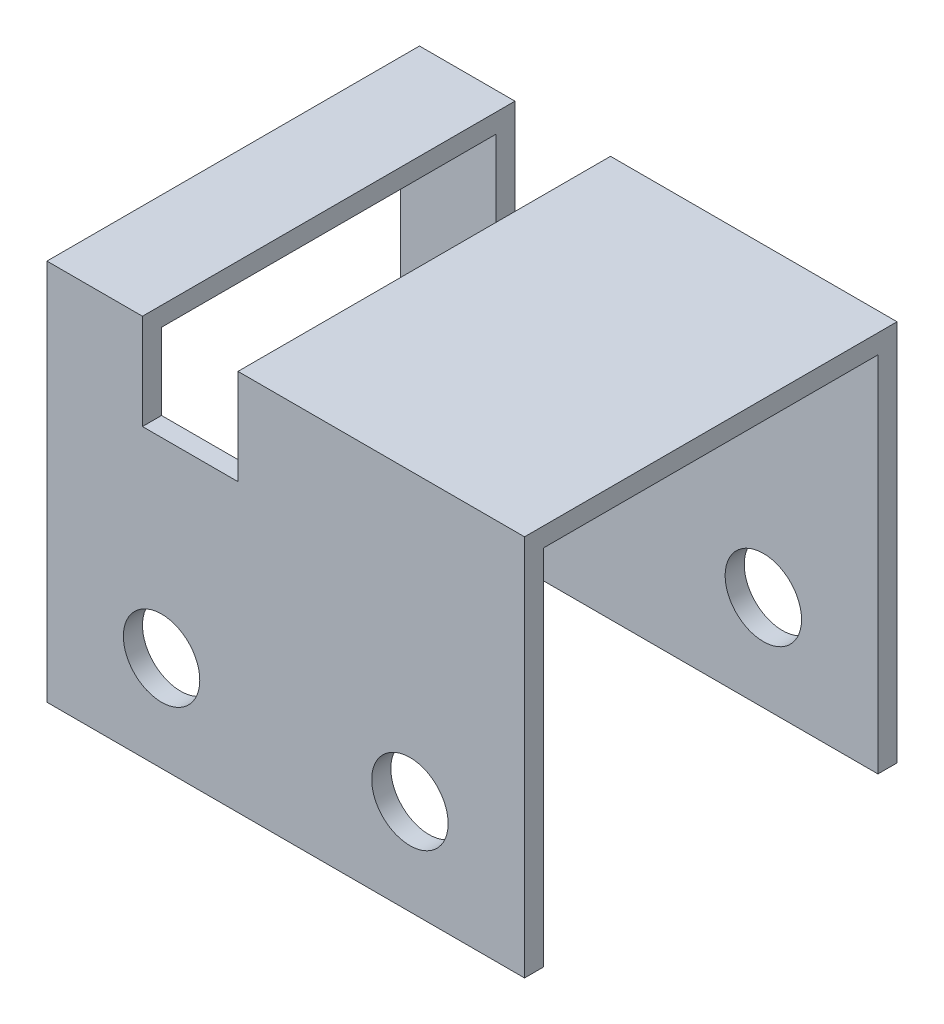
ISO-10303-21;
HEADER;
FILE_DESCRIPTION(('STEP AP214'),'2;1');
FILE_NAME('part.step','',(''),(''),'','','');
FILE_SCHEMA(('AUTOMOTIVE_DESIGN { 1 0 10303 214 1 1 1 1 }'));
ENDSEC;
DATA;
#1=APPLICATION_CONTEXT('core data for automotive mechanical design processes');
#2=APPLICATION_PROTOCOL_DEFINITION('international standard','automotive_design',2000,#1);
#3=PRODUCT_CONTEXT('',#1,'mechanical');
#4=PRODUCT('Part','Part','',(#3));
#5=PRODUCT_RELATED_PRODUCT_CATEGORY('part','',(#4));
#6=PRODUCT_DEFINITION_FORMATION('','',#4);
#7=PRODUCT_DEFINITION_CONTEXT('part definition',#1,'design');
#8=PRODUCT_DEFINITION('design','',#6,#7);
#9=PRODUCT_DEFINITION_SHAPE('','',#8);
#10=(LENGTH_UNIT() NAMED_UNIT(*) SI_UNIT(.MILLI.,.METRE.));
#11=(NAMED_UNIT(*) PLANE_ANGLE_UNIT() SI_UNIT($,.RADIAN.));
#12=(NAMED_UNIT(*) SI_UNIT($,.STERADIAN.) SOLID_ANGLE_UNIT());
#13=UNCERTAINTY_MEASURE_WITH_UNIT(LENGTH_MEASURE(1.E-05),#10,'distance_accuracy_value','');
#14=(GEOMETRIC_REPRESENTATION_CONTEXT(3) GLOBAL_UNCERTAINTY_ASSIGNED_CONTEXT((#13)) GLOBAL_UNIT_ASSIGNED_CONTEXT((#10,
#11,#12)) REPRESENTATION_CONTEXT('',''));
#15=CARTESIAN_POINT('',(0.,0.,0.));
#16=DIRECTION('',(0.,0.,1.));
#17=DIRECTION('',(1.,0.,0.));
#18=AXIS2_PLACEMENT_3D('',#15,#16,#17);
#19=CARTESIAN_POINT('',(-25.,-37.,19.5));
#20=DIRECTION('',(0.,1.,0.));
#21=DIRECTION('',(0.,0.,1.));
#22=AXIS2_PLACEMENT_3D('',#19,#20,#21);
#23=PLANE('',#22);
#24=DIRECTION('',(0.,0.,-1.));
#25=VECTOR('',#24,1.);
#26=CARTESIAN_POINT('',(25.,-37.,19.5));
#27=LINE('',#26,#25);
#28=CARTESIAN_POINT('',(25.,-37.,-17.5));
#29=VERTEX_POINT('',#28);
#30=CARTESIAN_POINT('',(25.,-37.,-19.5));
#31=VERTEX_POINT('',#30);
#32=EDGE_CURVE('E256',#29,#31,#27,.T.);
#33=ORIENTED_EDGE('',*,*,#32,.F.);
#34=DIRECTION('',(1.,0.,0.));
#35=VECTOR('',#34,1.);
#36=CARTESIAN_POINT('',(-25.,-37.,-17.5));
#37=LINE('',#36,#35);
#38=CARTESIAN_POINT('',(-25.,-37.,-17.5));
#39=VERTEX_POINT('',#38);
#40=EDGE_CURVE('E179',#39,#29,#37,.T.);
#41=ORIENTED_EDGE('',*,*,#40,.F.);
#42=DIRECTION('',(0.,0.,-1.));
#43=VECTOR('',#42,1.);
#44=CARTESIAN_POINT('',(-25.,-37.,19.5));
#45=LINE('',#44,#43);
#46=CARTESIAN_POINT('',(-25.,-37.,-19.5));
#47=VERTEX_POINT('',#46);
#48=EDGE_CURVE('E166',#39,#47,#45,.T.);
#49=ORIENTED_EDGE('',*,*,#48,.T.);
#50=DIRECTION('',(1.,0.,0.));
#51=VECTOR('',#50,1.);
#52=CARTESIAN_POINT('',(-25.,-37.,-19.5));
#53=LINE('',#52,#51);
#54=EDGE_CURVE('E221',#47,#31,#53,.T.);
#55=ORIENTED_EDGE('',*,*,#54,.T.);
#56=EDGE_LOOP('',(#33,#41,#49,#55));
#57=FACE_BOUND('',#56,.T.);
#58=ADVANCED_FACE('F33',(#57),#23,.F.);
#59=CARTESIAN_POINT('',(-15.,-7.,19.5));
#60=DIRECTION('',(0.,-1.,0.));
#61=DIRECTION('',(0.,0.,-1.));
#62=AXIS2_PLACEMENT_3D('',#59,#60,#61);
#63=PLANE('',#62);
#64=DIRECTION('',(0.,0.,-1.));
#65=VECTOR('',#64,1.);
#66=CARTESIAN_POINT('',(-15.,-7.,19.5));
#67=LINE('',#66,#65);
#68=CARTESIAN_POINT('',(-15.,-7.,-17.5));
#69=VERTEX_POINT('',#68);
#70=CARTESIAN_POINT('',(-15.,-7.,-19.5));
#71=VERTEX_POINT('',#70);
#72=EDGE_CURVE('E242',#69,#71,#67,.T.);
#73=ORIENTED_EDGE('',*,*,#72,.F.);
#74=DIRECTION('',(1.,0.,0.));
#75=VECTOR('',#74,1.);
#76=CARTESIAN_POINT('',(-15.,-7.,-17.5));
#77=LINE('',#76,#75);
#78=CARTESIAN_POINT('',(-5.,-7.,-17.5));
#79=VERTEX_POINT('',#78);
#80=EDGE_CURVE('E194',#69,#79,#77,.T.);
#81=ORIENTED_EDGE('',*,*,#80,.T.);
#82=DIRECTION('',(0.,0.,-1.));
#83=VECTOR('',#82,1.);
#84=CARTESIAN_POINT('',(-5.,-7.,19.5));
#85=LINE('',#84,#83);
#86=CARTESIAN_POINT('',(-5.,-7.,-19.5));
#87=VERTEX_POINT('',#86);
#88=EDGE_CURVE('E246',#79,#87,#85,.T.);
#89=ORIENTED_EDGE('',*,*,#88,.T.);
#90=DIRECTION('',(-1.,0.,0.));
#91=VECTOR('',#90,1.);
#92=CARTESIAN_POINT('',(-15.,-7.,-19.5));
#93=LINE('',#92,#91);
#94=EDGE_CURVE('E231',#87,#71,#93,.T.);
#95=ORIENTED_EDGE('',*,*,#94,.T.);
#96=EDGE_LOOP('',(#73,#81,#89,#95));
#97=FACE_BOUND('',#96,.T.);
#98=ADVANCED_FACE('F345',(#97),#63,.F.);
#99=CARTESIAN_POINT('',(-25.,-37.,19.5));
#100=DIRECTION('',(1.,0.,0.));
#101=DIRECTION('',(0.,1.,0.));
#102=AXIS2_PLACEMENT_3D('',#99,#100,#101);
#103=PLANE('',#102);
#104=ORIENTED_EDGE('',*,*,#48,.F.);
#105=DIRECTION('',(0.,1.,0.));
#106=VECTOR('',#105,1.);
#107=CARTESIAN_POINT('',(-25.,-37.,-17.5));
#108=LINE('',#107,#106);
#109=CARTESIAN_POINT('',(-25.,1.,-17.5));
#110=VERTEX_POINT('',#109);
#111=EDGE_CURVE('E148',#39,#110,#108,.T.);
#112=ORIENTED_EDGE('',*,*,#111,.T.);
#113=DIRECTION('',(0.,0.,1.));
#114=VECTOR('',#113,1.);
#115=CARTESIAN_POINT('',(-25.,1.,-17.5));
#116=LINE('',#115,#114);
#117=CARTESIAN_POINT('',(-25.,1.,17.5));
#118=VERTEX_POINT('',#117);
#119=EDGE_CURVE('E155',#110,#118,#116,.T.);
#120=ORIENTED_EDGE('',*,*,#119,.T.);
#121=DIRECTION('',(0.,-1.,0.));
#122=VECTOR('',#121,1.);
#123=CARTESIAN_POINT('',(-25.,1.,17.5));
#124=LINE('',#123,#122);
#125=CARTESIAN_POINT('',(-25.,-37.,17.5));
#126=VERTEX_POINT('',#125);
#127=EDGE_CURVE('E162',#118,#126,#124,.T.);
#128=ORIENTED_EDGE('',*,*,#127,.T.);
#129=CARTESIAN_POINT('',(-25.,-37.,19.5));
#130=VERTEX_POINT('',#129);
#131=EDGE_CURVE('E260',#130,#126,#45,.T.);
#132=ORIENTED_EDGE('',*,*,#131,.F.);
#133=DIRECTION('',(0.,-1.,0.));
#134=VECTOR('',#133,1.);
#135=CARTESIAN_POINT('',(-25.,-37.,19.5));
#136=LINE('',#135,#134);
#137=CARTESIAN_POINT('',(-25.,3.,19.5));
#138=VERTEX_POINT('',#137);
#139=EDGE_CURVE('E201',#138,#130,#136,.T.);
#140=ORIENTED_EDGE('',*,*,#139,.F.);
#141=DIRECTION('',(0.,0.,-1.));
#142=VECTOR('',#141,1.);
#143=CARTESIAN_POINT('',(-25.,3.,19.5));
#144=LINE('',#143,#142);
#145=CARTESIAN_POINT('',(-25.,3.,-19.5));
#146=VERTEX_POINT('',#145);
#147=EDGE_CURVE('E219',#138,#146,#144,.T.);
#148=ORIENTED_EDGE('',*,*,#147,.T.);
#149=DIRECTION('',(0.,-1.,0.));
#150=VECTOR('',#149,1.);
#151=CARTESIAN_POINT('',(-25.,-37.,-19.5));
#152=LINE('',#151,#150);
#153=EDGE_CURVE('E200',#146,#47,#152,.T.);
#154=ORIENTED_EDGE('',*,*,#153,.T.);
#155=EDGE_LOOP('',(#104,#112,#120,#128,#132,#140,#148,#154));
#156=FACE_BOUND('',#155,.T.);
#157=ADVANCED_FACE('F35',(#156),#103,.F.);
#158=ORIENTED_EDGE('',*,*,#131,.T.);
#159=DIRECTION('',(1.,0.,0.));
#160=VECTOR('',#159,1.);
#161=CARTESIAN_POINT('',(-25.,-37.,17.5));
#162=LINE('',#161,#160);
#163=CARTESIAN_POINT('',(25.,-37.,17.5));
#164=VERTEX_POINT('',#163);
#165=EDGE_CURVE('E182',#126,#164,#162,.T.);
#166=ORIENTED_EDGE('',*,*,#165,.T.);
#167=CARTESIAN_POINT('',(25.,-37.,19.5));
#168=VERTEX_POINT('',#167);
#169=EDGE_CURVE('E257',#168,#164,#27,.T.);
#170=ORIENTED_EDGE('',*,*,#169,.F.);
#171=DIRECTION('',(1.,0.,0.));
#172=VECTOR('',#171,1.);
#173=CARTESIAN_POINT('',(-25.,-37.,19.5));
#174=LINE('',#173,#172);
#175=EDGE_CURVE('E204',#130,#168,#174,.T.);
#176=ORIENTED_EDGE('',*,*,#175,.F.);
#177=EDGE_LOOP('',(#158,#166,#170,#176));
#178=FACE_BOUND('',#177,.T.);
#179=ADVANCED_FACE('F304',(#178),#23,.F.);
#180=CARTESIAN_POINT('',(25.,-37.,19.5));
#181=DIRECTION('',(-1.,0.,0.));
#182=DIRECTION('',(0.,0.,1.));
#183=AXIS2_PLACEMENT_3D('',#180,#181,#182);
#184=PLANE('',#183);
#185=DIRECTION('',(0.,0.,1.));
#186=VECTOR('',#185,1.);
#187=CARTESIAN_POINT('',(25.,1.,-17.5));
#188=LINE('',#187,#186);
#189=CARTESIAN_POINT('',(25.,1.,-17.5));
#190=VERTEX_POINT('',#189);
#191=CARTESIAN_POINT('',(25.,1.,17.5));
#192=VERTEX_POINT('',#191);
#193=EDGE_CURVE('E169',#190,#192,#188,.T.);
#194=ORIENTED_EDGE('',*,*,#193,.F.);
#195=DIRECTION('',(0.,1.,0.));
#196=VECTOR('',#195,1.);
#197=CARTESIAN_POINT('',(25.,-37.,-17.5));
#198=LINE('',#197,#196);
#199=EDGE_CURVE('E50',#29,#190,#198,.T.);
#200=ORIENTED_EDGE('',*,*,#199,.F.);
#201=ORIENTED_EDGE('',*,*,#32,.T.);
#202=DIRECTION('',(0.,1.,0.));
#203=VECTOR('',#202,1.);
#204=CARTESIAN_POINT('',(25.,-37.,-19.5));
#205=LINE('',#204,#203);
#206=CARTESIAN_POINT('',(25.,3.,-19.5));
#207=VERTEX_POINT('',#206);
#208=EDGE_CURVE('E224',#31,#207,#205,.T.);
#209=ORIENTED_EDGE('',*,*,#208,.T.);
#210=DIRECTION('',(0.,0.,-1.));
#211=VECTOR('',#210,1.);
#212=CARTESIAN_POINT('',(25.,3.,19.5));
#213=LINE('',#212,#211);
#214=CARTESIAN_POINT('',(25.,3.,19.5));
#215=VERTEX_POINT('',#214);
#216=EDGE_CURVE('E253',#215,#207,#213,.T.);
#217=ORIENTED_EDGE('',*,*,#216,.F.);
#218=DIRECTION('',(0.,1.,0.));
#219=VECTOR('',#218,1.);
#220=CARTESIAN_POINT('',(25.,-37.,19.5));
#221=LINE('',#220,#219);
#222=EDGE_CURVE('E207',#168,#215,#221,.T.);
#223=ORIENTED_EDGE('',*,*,#222,.F.);
#224=ORIENTED_EDGE('',*,*,#169,.T.);
#225=DIRECTION('',(0.,-1.,0.));
#226=VECTOR('',#225,1.);
#227=CARTESIAN_POINT('',(25.,1.,17.5));
#228=LINE('',#227,#226);
#229=EDGE_CURVE('E167',#192,#164,#228,.T.);
#230=ORIENTED_EDGE('',*,*,#229,.F.);
#231=EDGE_LOOP('',(#194,#200,#201,#209,#217,#223,#224,#230));
#232=FACE_BOUND('',#231,.T.);
#233=ADVANCED_FACE('F310',(#232),#184,.F.);
#234=CARTESIAN_POINT('',(-5.,3.,19.5));
#235=DIRECTION('',(0.,-1.,0.));
#236=DIRECTION('',(0.,0.,-1.));
#237=AXIS2_PLACEMENT_3D('',#234,#235,#236);
#238=PLANE('',#237);
#239=DIRECTION('',(-1.,0.,0.));
#240=VECTOR('',#239,1.);
#241=CARTESIAN_POINT('',(-5.,3.,-19.5));
#242=LINE('',#241,#240);
#243=CARTESIAN_POINT('',(-5.,3.,-19.5));
#244=VERTEX_POINT('',#243);
#245=EDGE_CURVE('E226',#207,#244,#242,.T.);
#246=ORIENTED_EDGE('',*,*,#245,.T.);
#247=DIRECTION('',(0.,0.,-1.));
#248=VECTOR('',#247,1.);
#249=CARTESIAN_POINT('',(-5.,3.,19.5));
#250=LINE('',#249,#248);
#251=CARTESIAN_POINT('',(-5.,3.,19.5));
#252=VERTEX_POINT('',#251);
#253=EDGE_CURVE('E250',#252,#244,#250,.T.);
#254=ORIENTED_EDGE('',*,*,#253,.F.);
#255=DIRECTION('',(-1.,0.,0.));
#256=VECTOR('',#255,1.);
#257=CARTESIAN_POINT('',(-5.,3.,19.5));
#258=LINE('',#257,#256);
#259=EDGE_CURVE('E209',#215,#252,#258,.T.);
#260=ORIENTED_EDGE('',*,*,#259,.F.);
#261=ORIENTED_EDGE('',*,*,#216,.T.);
#262=EDGE_LOOP('',(#246,#254,#260,#261));
#263=FACE_BOUND('',#262,.T.);
#264=ADVANCED_FACE('F316',(#263),#238,.F.);
#265=CARTESIAN_POINT('',(-5.,-7.,19.5));
#266=DIRECTION('',(1.,0.,0.));
#267=DIRECTION('',(0.,0.,-1.));
#268=AXIS2_PLACEMENT_3D('',#265,#266,#267);
#269=PLANE('',#268);
#270=ORIENTED_EDGE('',*,*,#88,.F.);
#271=DIRECTION('',(0.,1.,0.));
#272=VECTOR('',#271,1.);
#273=CARTESIAN_POINT('',(-5.,-7.,-17.5));
#274=LINE('',#273,#272);
#275=CARTESIAN_POINT('',(-5.,1.,-17.5));
#276=VERTEX_POINT('',#275);
#277=EDGE_CURVE('E197',#79,#276,#274,.T.);
#278=ORIENTED_EDGE('',*,*,#277,.T.);
#279=DIRECTION('',(0.,0.,1.));
#280=VECTOR('',#279,1.);
#281=CARTESIAN_POINT('',(-5.,1.,19.5));
#282=LINE('',#281,#280);
#283=CARTESIAN_POINT('',(-5.,1.,17.5));
#284=VERTEX_POINT('',#283);
#285=EDGE_CURVE('E181',#276,#284,#282,.T.);
#286=ORIENTED_EDGE('',*,*,#285,.T.);
#287=DIRECTION('',(0.,-1.,0.));
#288=VECTOR('',#287,1.);
#289=CARTESIAN_POINT('',(-5.,-7.,17.5));
#290=LINE('',#289,#288);
#291=CARTESIAN_POINT('',(-5.,-7.,17.5));
#292=VERTEX_POINT('',#291);
#293=EDGE_CURVE('E191',#284,#292,#290,.T.);
#294=ORIENTED_EDGE('',*,*,#293,.T.);
#295=CARTESIAN_POINT('',(-5.,-7.,19.5));
#296=VERTEX_POINT('',#295);
#297=EDGE_CURVE('E247',#296,#292,#85,.T.);
#298=ORIENTED_EDGE('',*,*,#297,.F.);
#299=DIRECTION('',(0.,-1.,0.));
#300=VECTOR('',#299,1.);
#301=CARTESIAN_POINT('',(-5.,-7.,19.5));
#302=LINE('',#301,#300);
#303=EDGE_CURVE('E211',#252,#296,#302,.T.);
#304=ORIENTED_EDGE('',*,*,#303,.F.);
#305=ORIENTED_EDGE('',*,*,#253,.T.);
#306=DIRECTION('',(0.,-1.,0.));
#307=VECTOR('',#306,1.);
#308=CARTESIAN_POINT('',(-5.,-7.,-19.5));
#309=LINE('',#308,#307);
#310=EDGE_CURVE('E228',#244,#87,#309,.T.);
#311=ORIENTED_EDGE('',*,*,#310,.T.);
#312=EDGE_LOOP('',(#270,#278,#286,#294,#298,#304,#305,#311));
#313=FACE_BOUND('',#312,.T.);
#314=ADVANCED_FACE('F321',(#313),#269,.F.);
#315=ORIENTED_EDGE('',*,*,#297,.T.);
#316=DIRECTION('',(-1.,0.,0.));
#317=VECTOR('',#316,1.);
#318=CARTESIAN_POINT('',(-15.,-7.,17.5));
#319=LINE('',#318,#317);
#320=CARTESIAN_POINT('',(-15.,-7.,17.5));
#321=VERTEX_POINT('',#320);
#322=EDGE_CURVE('E188',#292,#321,#319,.T.);
#323=ORIENTED_EDGE('',*,*,#322,.T.);
#324=CARTESIAN_POINT('',(-15.,-7.,19.5));
#325=VERTEX_POINT('',#324);
#326=EDGE_CURVE('E243',#325,#321,#67,.T.);
#327=ORIENTED_EDGE('',*,*,#326,.F.);
#328=DIRECTION('',(-1.,0.,0.));
#329=VECTOR('',#328,1.);
#330=CARTESIAN_POINT('',(-15.,-7.,19.5));
#331=LINE('',#330,#329);
#332=EDGE_CURVE('E213',#296,#325,#331,.T.);
#333=ORIENTED_EDGE('',*,*,#332,.F.);
#334=EDGE_LOOP('',(#315,#323,#327,#333));
#335=FACE_BOUND('',#334,.T.);
#336=ADVANCED_FACE('F325',(#335),#63,.F.);
#337=CARTESIAN_POINT('',(-15.,3.,19.5));
#338=DIRECTION('',(-1.,0.,0.));
#339=DIRECTION('',(0.,-1.,0.));
#340=AXIS2_PLACEMENT_3D('',#337,#338,#339);
#341=PLANE('',#340);
#342=DIRECTION('',(0.,0.,-1.));
#343=VECTOR('',#342,1.);
#344=CARTESIAN_POINT('',(-15.,1.,19.5));
#345=LINE('',#344,#343);
#346=CARTESIAN_POINT('',(-15.,1.,17.5));
#347=VERTEX_POINT('',#346);
#348=CARTESIAN_POINT('',(-15.,1.,-17.5));
#349=VERTEX_POINT('',#348);
#350=EDGE_CURVE('E263',#347,#349,#345,.T.);
#351=ORIENTED_EDGE('',*,*,#350,.T.);
#352=DIRECTION('',(0.,-1.,0.));
#353=VECTOR('',#352,1.);
#354=CARTESIAN_POINT('',(-15.,3.,-17.5));
#355=LINE('',#354,#353);
#356=EDGE_CURVE('E11',#349,#69,#355,.T.);
#357=ORIENTED_EDGE('',*,*,#356,.T.);
#358=ORIENTED_EDGE('',*,*,#72,.T.);
#359=DIRECTION('',(0.,1.,0.));
#360=VECTOR('',#359,1.);
#361=CARTESIAN_POINT('',(-15.,3.,-19.5));
#362=LINE('',#361,#360);
#363=CARTESIAN_POINT('',(-15.,3.,-19.5));
#364=VERTEX_POINT('',#363);
#365=EDGE_CURVE('E234',#71,#364,#362,.T.);
#366=ORIENTED_EDGE('',*,*,#365,.T.);
#367=DIRECTION('',(0.,0.,-1.));
#368=VECTOR('',#367,1.);
#369=CARTESIAN_POINT('',(-15.,3.,19.5));
#370=LINE('',#369,#368);
#371=CARTESIAN_POINT('',(-15.,3.,19.5));
#372=VERTEX_POINT('',#371);
#373=EDGE_CURVE('E239',#372,#364,#370,.T.);
#374=ORIENTED_EDGE('',*,*,#373,.F.);
#375=DIRECTION('',(0.,1.,0.));
#376=VECTOR('',#375,1.);
#377=CARTESIAN_POINT('',(-15.,3.,19.5));
#378=LINE('',#377,#376);
#379=EDGE_CURVE('E215',#325,#372,#378,.T.);
#380=ORIENTED_EDGE('',*,*,#379,.F.);
#381=ORIENTED_EDGE('',*,*,#326,.T.);
#382=DIRECTION('',(0.,1.,0.));
#383=VECTOR('',#382,1.);
#384=CARTESIAN_POINT('',(-15.,3.,17.5));
#385=LINE('',#384,#383);
#386=EDGE_CURVE('E42',#321,#347,#385,.T.);
#387=ORIENTED_EDGE('',*,*,#386,.T.);
#388=EDGE_LOOP('',(#351,#357,#358,#366,#374,#380,#381,#387));
#389=FACE_BOUND('',#388,.T.);
#390=ADVANCED_FACE('F329',(#389),#341,.F.);
#391=CARTESIAN_POINT('',(-25.,3.,19.5));
#392=DIRECTION('',(0.,-1.,0.));
#393=DIRECTION('',(0.,0.,-1.));
#394=AXIS2_PLACEMENT_3D('',#391,#392,#393);
#395=PLANE('',#394);
#396=DIRECTION('',(-1.,0.,0.));
#397=VECTOR('',#396,1.);
#398=CARTESIAN_POINT('',(-25.,3.,-19.5));
#399=LINE('',#398,#397);
#400=EDGE_CURVE('E205',#364,#146,#399,.T.);
#401=ORIENTED_EDGE('',*,*,#400,.T.);
#402=ORIENTED_EDGE('',*,*,#147,.F.);
#403=DIRECTION('',(-1.,0.,0.));
#404=VECTOR('',#403,1.);
#405=CARTESIAN_POINT('',(-25.,3.,19.5));
#406=LINE('',#405,#404);
#407=EDGE_CURVE('E217',#372,#138,#406,.T.);
#408=ORIENTED_EDGE('',*,*,#407,.F.);
#409=ORIENTED_EDGE('',*,*,#373,.T.);
#410=EDGE_LOOP('',(#401,#402,#408,#409));
#411=FACE_BOUND('',#410,.T.);
#412=ADVANCED_FACE('F295',(#411),#395,.F.);
#413=CARTESIAN_POINT('',(0.,0.,19.5));
#414=DIRECTION('',(0.,0.,-1.));
#415=DIRECTION('',(-1.,0.,0.));
#416=AXIS2_PLACEMENT_3D('',#413,#414,#415);
#417=PLANE('',#416);
#418=CARTESIAN_POINT('',(-13.,-27.,19.5));
#419=DIRECTION('',(0.,0.,1.));
#420=DIRECTION('',(1.,0.,0.));
#421=AXIS2_PLACEMENT_3D('',#418,#419,#420);
#422=CIRCLE('',#421,4.);
#423=CARTESIAN_POINT('',(-9.,-27.,19.5));
#424=VERTEX_POINT('',#423);
#425=EDGE_CURVE('E274',#424,#424,#422,.T.);
#426=ORIENTED_EDGE('',*,*,#425,.F.);
#427=EDGE_LOOP('',(#426));
#428=FACE_BOUND('',#427,.T.);
#429=CARTESIAN_POINT('',(13.,-27.,19.5));
#430=DIRECTION('',(0.,0.,1.));
#431=DIRECTION('',(1.,0.,0.));
#432=AXIS2_PLACEMENT_3D('',#429,#430,#431);
#433=CIRCLE('',#432,4.);
#434=CARTESIAN_POINT('',(17.,-27.,19.5));
#435=VERTEX_POINT('',#434);
#436=EDGE_CURVE('E284',#435,#435,#433,.T.);
#437=ORIENTED_EDGE('',*,*,#436,.F.);
#438=EDGE_LOOP('',(#437));
#439=FACE_BOUND('',#438,.T.);
#440=ORIENTED_EDGE('',*,*,#139,.T.);
#441=ORIENTED_EDGE('',*,*,#175,.T.);
#442=ORIENTED_EDGE('',*,*,#222,.T.);
#443=ORIENTED_EDGE('',*,*,#259,.T.);
#444=ORIENTED_EDGE('',*,*,#303,.T.);
#445=ORIENTED_EDGE('',*,*,#332,.T.);
#446=ORIENTED_EDGE('',*,*,#379,.T.);
#447=ORIENTED_EDGE('',*,*,#407,.T.);
#448=EDGE_LOOP('',(#440,#441,#442,#443,#444,#445,#446,#447));
#449=FACE_BOUND('',#448,.T.);
#450=ADVANCED_FACE('F291',(#428,#439,#449),#417,.F.);
#451=CARTESIAN_POINT('',(0.,0.,-19.5));
#452=DIRECTION('',(0.,0.,-1.));
#453=DIRECTION('',(-1.,0.,0.));
#454=AXIS2_PLACEMENT_3D('',#451,#452,#453);
#455=PLANE('',#454);
#456=CARTESIAN_POINT('',(-13.,-27.,-19.5));
#457=DIRECTION('',(0.,0.,1.));
#458=DIRECTION('',(1.,0.,0.));
#459=AXIS2_PLACEMENT_3D('',#456,#457,#458);
#460=CIRCLE('',#459,4.);
#461=CARTESIAN_POINT('',(-9.,-27.,-19.5));
#462=VERTEX_POINT('',#461);
#463=EDGE_CURVE('E269',#462,#462,#460,.T.);
#464=ORIENTED_EDGE('',*,*,#463,.T.);
#465=EDGE_LOOP('',(#464));
#466=FACE_BOUND('',#465,.T.);
#467=CARTESIAN_POINT('',(13.,-27.,-19.5));
#468=DIRECTION('',(0.,0.,1.));
#469=DIRECTION('',(1.,0.,0.));
#470=AXIS2_PLACEMENT_3D('',#467,#468,#469);
#471=CIRCLE('',#470,4.);
#472=CARTESIAN_POINT('',(17.,-27.,-19.5));
#473=VERTEX_POINT('',#472);
#474=EDGE_CURVE('E279',#473,#473,#471,.T.);
#475=ORIENTED_EDGE('',*,*,#474,.T.);
#476=EDGE_LOOP('',(#475));
#477=FACE_BOUND('',#476,.T.);
#478=ORIENTED_EDGE('',*,*,#153,.F.);
#479=ORIENTED_EDGE('',*,*,#400,.F.);
#480=ORIENTED_EDGE('',*,*,#365,.F.);
#481=ORIENTED_EDGE('',*,*,#94,.F.);
#482=ORIENTED_EDGE('',*,*,#310,.F.);
#483=ORIENTED_EDGE('',*,*,#245,.F.);
#484=ORIENTED_EDGE('',*,*,#208,.F.);
#485=ORIENTED_EDGE('',*,*,#54,.F.);
#486=EDGE_LOOP('',(#478,#479,#480,#481,#482,#483,#484,#485));
#487=FACE_BOUND('',#486,.T.);
#488=ADVANCED_FACE('F294',(#466,#477,#487),#455,.T.);
#489=CARTESIAN_POINT('',(-25.,-37.,-17.5));
#490=DIRECTION('',(0.,0.,-1.));
#491=DIRECTION('',(-1.,0.,0.));
#492=AXIS2_PLACEMENT_3D('',#489,#490,#491);
#493=PLANE('',#492);
#494=CARTESIAN_POINT('',(-13.,-27.,-17.5));
#495=DIRECTION('',(0.,0.,-1.));
#496=DIRECTION('',(-1.,0.,0.));
#497=AXIS2_PLACEMENT_3D('',#494,#495,#496);
#498=CIRCLE('',#497,4.);
#499=CARTESIAN_POINT('',(-17.,-27.,-17.5));
#500=VERTEX_POINT('',#499);
#501=EDGE_CURVE('E172',#500,#500,#498,.T.);
#502=ORIENTED_EDGE('',*,*,#501,.T.);
#503=EDGE_LOOP('',(#502));
#504=FACE_BOUND('',#503,.T.);
#505=CARTESIAN_POINT('',(13.,-27.,-17.5));
#506=DIRECTION('',(0.,0.,-1.));
#507=DIRECTION('',(-1.,0.,0.));
#508=AXIS2_PLACEMENT_3D('',#505,#506,#507);
#509=CIRCLE('',#508,4.);
#510=CARTESIAN_POINT('',(9.,-27.,-17.5));
#511=VERTEX_POINT('',#510);
#512=EDGE_CURVE('E268',#511,#511,#509,.T.);
#513=ORIENTED_EDGE('',*,*,#512,.T.);
#514=EDGE_LOOP('',(#513));
#515=FACE_BOUND('',#514,.T.);
#516=ORIENTED_EDGE('',*,*,#80,.F.);
#517=ORIENTED_EDGE('',*,*,#356,.F.);
#518=DIRECTION('',(1.,0.,0.));
#519=VECTOR('',#518,1.);
#520=CARTESIAN_POINT('',(-25.,1.,-17.5));
#521=LINE('',#520,#519);
#522=EDGE_CURVE('E58',#110,#349,#521,.T.);
#523=ORIENTED_EDGE('',*,*,#522,.F.);
#524=ORIENTED_EDGE('',*,*,#111,.F.);
#525=ORIENTED_EDGE('',*,*,#40,.T.);
#526=ORIENTED_EDGE('',*,*,#199,.T.);
#527=EDGE_CURVE('E152',#276,#190,#521,.T.);
#528=ORIENTED_EDGE('',*,*,#527,.F.);
#529=ORIENTED_EDGE('',*,*,#277,.F.);
#530=EDGE_LOOP('',(#516,#517,#523,#524,#525,#526,#528,#529));
#531=FACE_BOUND('',#530,.T.);
#532=ADVANCED_FACE('F146',(#504,#515,#531),#493,.F.);
#533=CARTESIAN_POINT('',(-25.,1.,17.5));
#534=DIRECTION('',(0.,0.,1.));
#535=DIRECTION('',(1.,0.,0.));
#536=AXIS2_PLACEMENT_3D('',#533,#534,#535);
#537=PLANE('',#536);
#538=CARTESIAN_POINT('',(-13.,-27.,17.5));
#539=DIRECTION('',(0.,0.,1.));
#540=DIRECTION('',(1.,0.,0.));
#541=AXIS2_PLACEMENT_3D('',#538,#539,#540);
#542=CIRCLE('',#541,4.);
#543=CARTESIAN_POINT('',(-9.,-27.,17.5));
#544=VERTEX_POINT('',#543);
#545=EDGE_CURVE('E37',#544,#544,#542,.T.);
#546=ORIENTED_EDGE('',*,*,#545,.T.);
#547=EDGE_LOOP('',(#546));
#548=FACE_BOUND('',#547,.T.);
#549=CARTESIAN_POINT('',(13.,-27.,17.5));
#550=DIRECTION('',(0.,0.,1.));
#551=DIRECTION('',(1.,0.,0.));
#552=AXIS2_PLACEMENT_3D('',#549,#550,#551);
#553=CIRCLE('',#552,4.);
#554=CARTESIAN_POINT('',(17.,-27.,17.5));
#555=VERTEX_POINT('',#554);
#556=EDGE_CURVE('E266',#555,#555,#553,.T.);
#557=ORIENTED_EDGE('',*,*,#556,.T.);
#558=EDGE_LOOP('',(#557));
#559=FACE_BOUND('',#558,.T.);
#560=DIRECTION('',(1.,0.,0.));
#561=VECTOR('',#560,1.);
#562=CARTESIAN_POINT('',(-25.,1.,17.5));
#563=LINE('',#562,#561);
#564=EDGE_CURVE('E151',#284,#192,#563,.T.);
#565=ORIENTED_EDGE('',*,*,#564,.T.);
#566=ORIENTED_EDGE('',*,*,#229,.T.);
#567=ORIENTED_EDGE('',*,*,#165,.F.);
#568=ORIENTED_EDGE('',*,*,#127,.F.);
#569=EDGE_CURVE('E158',#118,#347,#563,.T.);
#570=ORIENTED_EDGE('',*,*,#569,.T.);
#571=ORIENTED_EDGE('',*,*,#386,.F.);
#572=ORIENTED_EDGE('',*,*,#322,.F.);
#573=ORIENTED_EDGE('',*,*,#293,.F.);
#574=EDGE_LOOP('',(#565,#566,#567,#568,#570,#571,#572,#573));
#575=FACE_BOUND('',#574,.T.);
#576=ADVANCED_FACE('F347',(#548,#559,#575),#537,.F.);
#577=CARTESIAN_POINT('',(-25.,1.,-17.5));
#578=DIRECTION('',(0.,1.,0.));
#579=DIRECTION('',(0.,0.,1.));
#580=AXIS2_PLACEMENT_3D('',#577,#578,#579);
#581=PLANE('',#580);
#582=ORIENTED_EDGE('',*,*,#527,.T.);
#583=ORIENTED_EDGE('',*,*,#193,.T.);
#584=ORIENTED_EDGE('',*,*,#564,.F.);
#585=ORIENTED_EDGE('',*,*,#285,.F.);
#586=EDGE_LOOP('',(#582,#583,#584,#585));
#587=FACE_BOUND('',#586,.T.);
#588=ADVANCED_FACE('F341',(#587),#581,.F.);
#589=ORIENTED_EDGE('',*,*,#569,.F.);
#590=ORIENTED_EDGE('',*,*,#119,.F.);
#591=ORIENTED_EDGE('',*,*,#522,.T.);
#592=ORIENTED_EDGE('',*,*,#350,.F.);
#593=EDGE_LOOP('',(#589,#590,#591,#592));
#594=FACE_BOUND('',#593,.T.);
#595=ADVANCED_FACE('F156',(#594),#581,.F.);
#596=CARTESIAN_POINT('',(13.,-27.,-19.5));
#597=DIRECTION('',(0.,0.,1.));
#598=DIRECTION('',(1.,0.,0.));
#599=AXIS2_PLACEMENT_3D('',#596,#597,#598);
#600=CYLINDRICAL_SURFACE('',#599,4.);
#601=ORIENTED_EDGE('',*,*,#436,.T.);
#602=EDGE_LOOP('',(#601));
#603=FACE_BOUND('',#602,.T.);
#604=ORIENTED_EDGE('',*,*,#556,.F.);
#605=EDGE_LOOP('',(#604));
#606=FACE_BOUND('',#605,.T.);
#607=ADVANCED_FACE('F288',(#603,#606),#600,.F.);
#608=CARTESIAN_POINT('',(-13.,-27.,-19.5));
#609=DIRECTION('',(0.,0.,1.));
#610=DIRECTION('',(1.,0.,0.));
#611=AXIS2_PLACEMENT_3D('',#608,#609,#610);
#612=CYLINDRICAL_SURFACE('',#611,4.);
#613=ORIENTED_EDGE('',*,*,#425,.T.);
#614=EDGE_LOOP('',(#613));
#615=FACE_BOUND('',#614,.T.);
#616=ORIENTED_EDGE('',*,*,#545,.F.);
#617=EDGE_LOOP('',(#616));
#618=FACE_BOUND('',#617,.T.);
#619=ADVANCED_FACE('F465',(#615,#618),#612,.F.);
#620=ORIENTED_EDGE('',*,*,#474,.F.);
#621=EDGE_LOOP('',(#620));
#622=FACE_BOUND('',#621,.T.);
#623=ORIENTED_EDGE('',*,*,#512,.F.);
#624=EDGE_LOOP('',(#623));
#625=FACE_BOUND('',#624,.T.);
#626=ADVANCED_FACE('F466',(#622,#625),#600,.F.);
#627=ORIENTED_EDGE('',*,*,#463,.F.);
#628=EDGE_LOOP('',(#627));
#629=FACE_BOUND('',#628,.T.);
#630=ORIENTED_EDGE('',*,*,#501,.F.);
#631=EDGE_LOOP('',(#630));
#632=FACE_BOUND('',#631,.T.);
#633=ADVANCED_FACE('F476',(#629,#632),#612,.F.);
#634=CLOSED_SHELL('',(#58,#98,#157,#179,#233,#264,#314,#336,#390,#412,#450,#488,#532,#576,#588,
#595,#607,#619,#626,#633));
#635=MANIFOLD_SOLID_BREP('B2',#634);
#636=ADVANCED_BREP_SHAPE_REPRESENTATION('',(#18,#635),#14);
#637=SHAPE_DEFINITION_REPRESENTATION(#9,#636);
ENDSEC;
END-ISO-10303-21;
